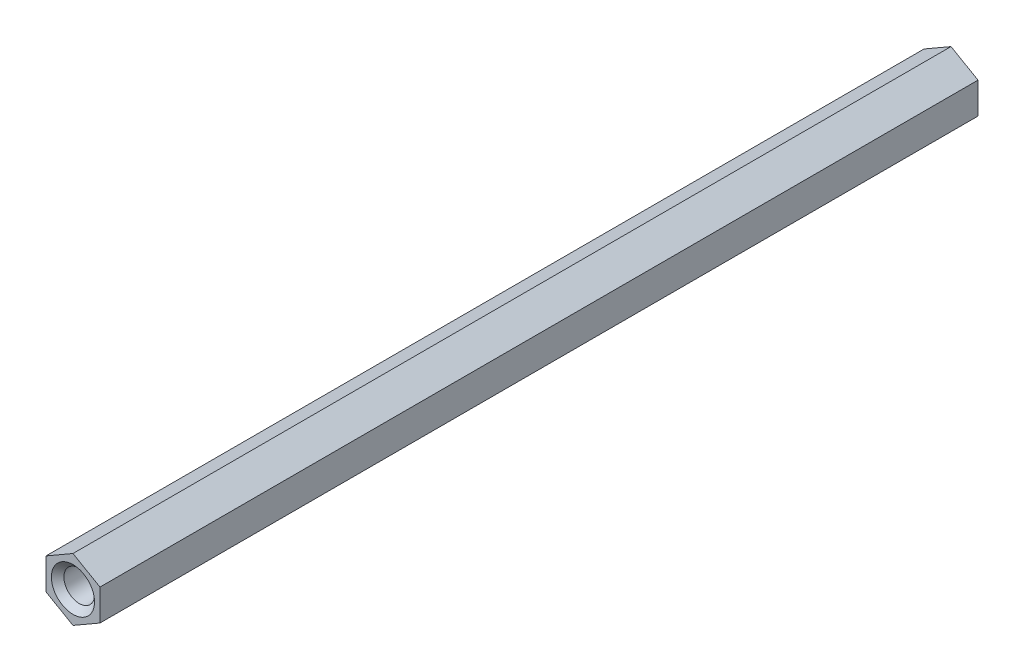
ISO-10303-21;
HEADER;
FILE_DESCRIPTION(('STEP AP214'),'2;1');
FILE_NAME('part.step','',(''),(''),'','','');
FILE_SCHEMA(('AUTOMOTIVE_DESIGN { 1 0 10303 214 1 1 1 1 }'));
ENDSEC;
DATA;
#1=APPLICATION_CONTEXT('core data for automotive mechanical design processes');
#2=APPLICATION_PROTOCOL_DEFINITION('international standard','automotive_design',2000,#1);
#3=PRODUCT_CONTEXT('',#1,'mechanical');
#4=PRODUCT('Part','Part','',(#3));
#5=PRODUCT_RELATED_PRODUCT_CATEGORY('part','',(#4));
#6=PRODUCT_DEFINITION_FORMATION('','',#4);
#7=PRODUCT_DEFINITION_CONTEXT('part definition',#1,'design');
#8=PRODUCT_DEFINITION('design','',#6,#7);
#9=PRODUCT_DEFINITION_SHAPE('','',#8);
#10=(LENGTH_UNIT() NAMED_UNIT(*) SI_UNIT(.MILLI.,.METRE.));
#11=(NAMED_UNIT(*) PLANE_ANGLE_UNIT() SI_UNIT($,.RADIAN.));
#12=(NAMED_UNIT(*) SI_UNIT($,.STERADIAN.) SOLID_ANGLE_UNIT());
#13=UNCERTAINTY_MEASURE_WITH_UNIT(LENGTH_MEASURE(1.E-05),#10,'distance_accuracy_value','');
#14=(GEOMETRIC_REPRESENTATION_CONTEXT(3) GLOBAL_UNCERTAINTY_ASSIGNED_CONTEXT((#13)) GLOBAL_UNIT_ASSIGNED_CONTEXT((#10,
#11,#12)) REPRESENTATION_CONTEXT('',''));
#15=CARTESIAN_POINT('',(0.,0.,0.));
#16=DIRECTION('',(0.,0.,1.));
#17=DIRECTION('',(1.,0.,0.));
#18=AXIS2_PLACEMENT_3D('',#15,#16,#17);
#19=CARTESIAN_POINT('',(-4.7625,2.74963065701559,77.4999999999948));
#20=DIRECTION('',(0.5,-0.866025403784439,0.));
#21=DIRECTION('',(0.866025403784439,0.5,0.));
#22=AXIS2_PLACEMENT_3D('',#19,#20,#21);
#23=PLANE('',#22);
#24=DIRECTION('',(-0.866025403784439,-0.5,0.));
#25=VECTOR('',#24,1.);
#26=CARTESIAN_POINT('',(-4.7625,2.74963065701559,-77.4999999999948));
#27=LINE('',#26,#25);
#28=CARTESIAN_POINT('',(0.,5.49926131403118,-77.4999999999948));
#29=VERTEX_POINT('',#28);
#30=CARTESIAN_POINT('',(-4.7625,2.74963065701559,-77.4999999999948));
#31=VERTEX_POINT('',#30);
#32=EDGE_CURVE('E145',#29,#31,#27,.T.);
#33=ORIENTED_EDGE('',*,*,#32,.T.);
#34=DIRECTION('',(0.,0.,-1.));
#35=VECTOR('',#34,1.);
#36=CARTESIAN_POINT('',(-4.7625,2.74963065701559,77.4999999999948));
#37=LINE('',#36,#35);
#38=CARTESIAN_POINT('',(-4.7625,2.74963065701559,77.4999999999948));
#39=VERTEX_POINT('',#38);
#40=EDGE_CURVE('E11',#39,#31,#37,.T.);
#41=ORIENTED_EDGE('',*,*,#40,.F.);
#42=DIRECTION('',(-0.866025403784439,-0.5,0.));
#43=VECTOR('',#42,1.);
#44=CARTESIAN_POINT('',(-4.7625,2.74963065701559,77.4999999999948));
#45=LINE('',#44,#43);
#46=CARTESIAN_POINT('',(0.,5.49926131403118,77.4999999999948));
#47=VERTEX_POINT('',#46);
#48=EDGE_CURVE('E162',#47,#39,#45,.T.);
#49=ORIENTED_EDGE('',*,*,#48,.F.);
#50=DIRECTION('',(0.,0.,-1.));
#51=VECTOR('',#50,1.);
#52=CARTESIAN_POINT('',(0.,5.49926131403118,77.4999999999948));
#53=LINE('',#52,#51);
#54=EDGE_CURVE('E141',#47,#29,#53,.T.);
#55=ORIENTED_EDGE('',*,*,#54,.T.);
#56=EDGE_LOOP('',(#33,#41,#49,#55));
#57=FACE_BOUND('',#56,.T.);
#58=ADVANCED_FACE('F53',(#57),#23,.F.);
#59=CARTESIAN_POINT('',(-4.7625,-2.74963065701559,77.4999999999948));
#60=DIRECTION('',(1.,0.,0.));
#61=DIRECTION('',(0.,1.,0.));
#62=AXIS2_PLACEMENT_3D('',#59,#60,#61);
#63=PLANE('',#62);
#64=DIRECTION('',(0.,-1.,0.));
#65=VECTOR('',#64,1.);
#66=CARTESIAN_POINT('',(-4.7625,-2.74963065701559,-77.4999999999948));
#67=LINE('',#66,#65);
#68=CARTESIAN_POINT('',(-4.7625,-2.74963065701559,-77.4999999999948));
#69=VERTEX_POINT('',#68);
#70=EDGE_CURVE('E149',#31,#69,#67,.T.);
#71=ORIENTED_EDGE('',*,*,#70,.T.);
#72=DIRECTION('',(0.,0.,-1.));
#73=VECTOR('',#72,1.);
#74=CARTESIAN_POINT('',(-4.7625,-2.74963065701559,77.4999999999948));
#75=LINE('',#74,#73);
#76=CARTESIAN_POINT('',(-4.7625,-2.74963065701559,77.4999999999948));
#77=VERTEX_POINT('',#76);
#78=EDGE_CURVE('E62',#77,#69,#75,.T.);
#79=ORIENTED_EDGE('',*,*,#78,.F.);
#80=DIRECTION('',(0.,-1.,0.));
#81=VECTOR('',#80,1.);
#82=CARTESIAN_POINT('',(-4.7625,-2.74963065701559,77.4999999999948));
#83=LINE('',#82,#81);
#84=EDGE_CURVE('E108',#39,#77,#83,.T.);
#85=ORIENTED_EDGE('',*,*,#84,.F.);
#86=ORIENTED_EDGE('',*,*,#40,.T.);
#87=EDGE_LOOP('',(#71,#79,#85,#86));
#88=FACE_BOUND('',#87,.T.);
#89=ADVANCED_FACE('F191',(#88),#63,.F.);
#90=CARTESIAN_POINT('',(0.,-5.49926131403118,77.4999999999948));
#91=DIRECTION('',(0.5,0.866025403784439,0.));
#92=DIRECTION('',(-0.866025403784439,0.5,0.));
#93=AXIS2_PLACEMENT_3D('',#90,#91,#92);
#94=PLANE('',#93);
#95=DIRECTION('',(0.866025403784439,-0.5,0.));
#96=VECTOR('',#95,1.);
#97=CARTESIAN_POINT('',(0.,-5.49926131403118,-77.4999999999948));
#98=LINE('',#97,#96);
#99=CARTESIAN_POINT('',(0.,-5.49926131403118,-77.4999999999948));
#100=VERTEX_POINT('',#99);
#101=EDGE_CURVE('E153',#69,#100,#98,.T.);
#102=ORIENTED_EDGE('',*,*,#101,.T.);
#103=DIRECTION('',(0.,0.,-1.));
#104=VECTOR('',#103,1.);
#105=CARTESIAN_POINT('',(0.,-5.49926131403118,77.4999999999948));
#106=LINE('',#105,#104);
#107=CARTESIAN_POINT('',(0.,-5.49926131403118,77.4999999999948));
#108=VERTEX_POINT('',#107);
#109=EDGE_CURVE('E134',#108,#100,#106,.T.);
#110=ORIENTED_EDGE('',*,*,#109,.F.);
#111=DIRECTION('',(0.866025403784439,-0.5,0.));
#112=VECTOR('',#111,1.);
#113=CARTESIAN_POINT('',(0.,-5.49926131403118,77.4999999999948));
#114=LINE('',#113,#112);
#115=EDGE_CURVE('E123',#77,#108,#114,.T.);
#116=ORIENTED_EDGE('',*,*,#115,.F.);
#117=ORIENTED_EDGE('',*,*,#78,.T.);
#118=EDGE_LOOP('',(#102,#110,#116,#117));
#119=FACE_BOUND('',#118,.T.);
#120=ADVANCED_FACE('F172',(#119),#94,.F.);
#121=CARTESIAN_POINT('',(4.7625,-2.7496306570156,77.4999999999948));
#122=DIRECTION('',(-0.5,0.866025403784439,0.));
#123=DIRECTION('',(-0.866025403784439,-0.5,0.));
#124=AXIS2_PLACEMENT_3D('',#121,#122,#123);
#125=PLANE('',#124);
#126=DIRECTION('',(0.866025403784439,0.5,0.));
#127=VECTOR('',#126,1.);
#128=CARTESIAN_POINT('',(4.7625,-2.7496306570156,-77.4999999999948));
#129=LINE('',#128,#127);
#130=CARTESIAN_POINT('',(4.7625,-2.7496306570156,-77.4999999999948));
#131=VERTEX_POINT('',#130);
#132=EDGE_CURVE('E132',#100,#131,#129,.T.);
#133=ORIENTED_EDGE('',*,*,#132,.T.);
#134=DIRECTION('',(0.,0.,-1.));
#135=VECTOR('',#134,1.);
#136=CARTESIAN_POINT('',(4.7625,-2.7496306570156,77.4999999999948));
#137=LINE('',#136,#135);
#138=CARTESIAN_POINT('',(4.7625,-2.7496306570156,77.4999999999948));
#139=VERTEX_POINT('',#138);
#140=EDGE_CURVE('E129',#139,#131,#137,.T.);
#141=ORIENTED_EDGE('',*,*,#140,.F.);
#142=DIRECTION('',(0.866025403784439,0.5,0.));
#143=VECTOR('',#142,1.);
#144=CARTESIAN_POINT('',(4.7625,-2.7496306570156,77.4999999999948));
#145=LINE('',#144,#143);
#146=EDGE_CURVE('E117',#108,#139,#145,.T.);
#147=ORIENTED_EDGE('',*,*,#146,.F.);
#148=ORIENTED_EDGE('',*,*,#109,.T.);
#149=EDGE_LOOP('',(#133,#141,#147,#148));
#150=FACE_BOUND('',#149,.T.);
#151=ADVANCED_FACE('F130',(#150),#125,.F.);
#152=CARTESIAN_POINT('',(4.7625,2.74963065701559,77.4999999999948));
#153=DIRECTION('',(-1.,0.,0.));
#154=DIRECTION('',(0.,0.,1.));
#155=AXIS2_PLACEMENT_3D('',#152,#153,#154);
#156=PLANE('',#155);
#157=DIRECTION('',(0.,1.,0.));
#158=VECTOR('',#157,1.);
#159=CARTESIAN_POINT('',(4.7625,2.74963065701559,-77.4999999999948));
#160=LINE('',#159,#158);
#161=CARTESIAN_POINT('',(4.7625,2.74963065701559,-77.4999999999948));
#162=VERTEX_POINT('',#161);
#163=EDGE_CURVE('E94',#131,#162,#160,.T.);
#164=ORIENTED_EDGE('',*,*,#163,.T.);
#165=DIRECTION('',(0.,0.,-1.));
#166=VECTOR('',#165,1.);
#167=CARTESIAN_POINT('',(4.7625,2.74963065701559,77.4999999999948));
#168=LINE('',#167,#166);
#169=CARTESIAN_POINT('',(4.7625,2.74963065701559,77.4999999999948));
#170=VERTEX_POINT('',#169);
#171=EDGE_CURVE('E135',#170,#162,#168,.T.);
#172=ORIENTED_EDGE('',*,*,#171,.F.);
#173=DIRECTION('',(0.,1.,0.));
#174=VECTOR('',#173,1.);
#175=CARTESIAN_POINT('',(4.7625,2.74963065701559,77.4999999999948));
#176=LINE('',#175,#174);
#177=EDGE_CURVE('E121',#139,#170,#176,.T.);
#178=ORIENTED_EDGE('',*,*,#177,.F.);
#179=ORIENTED_EDGE('',*,*,#140,.T.);
#180=EDGE_LOOP('',(#164,#172,#178,#179));
#181=FACE_BOUND('',#180,.T.);
#182=ADVANCED_FACE('F137',(#181),#156,.F.);
#183=CARTESIAN_POINT('',(0.,5.49926131403118,77.4999999999948));
#184=DIRECTION('',(-0.5,-0.866025403784439,0.));
#185=DIRECTION('',(0.866025403784439,-0.5,0.));
#186=AXIS2_PLACEMENT_3D('',#183,#184,#185);
#187=PLANE('',#186);
#188=DIRECTION('',(-0.866025403784439,0.5,0.));
#189=VECTOR('',#188,1.);
#190=CARTESIAN_POINT('',(0.,5.49926131403118,-77.4999999999948));
#191=LINE('',#190,#189);
#192=EDGE_CURVE('E100',#162,#29,#191,.T.);
#193=ORIENTED_EDGE('',*,*,#192,.T.);
#194=ORIENTED_EDGE('',*,*,#54,.F.);
#195=DIRECTION('',(-0.866025403784439,0.5,0.));
#196=VECTOR('',#195,1.);
#197=CARTESIAN_POINT('',(0.,5.49926131403118,77.4999999999948));
#198=LINE('',#197,#196);
#199=EDGE_CURVE('E70',#170,#47,#198,.T.);
#200=ORIENTED_EDGE('',*,*,#199,.F.);
#201=ORIENTED_EDGE('',*,*,#171,.T.);
#202=EDGE_LOOP('',(#193,#194,#200,#201));
#203=FACE_BOUND('',#202,.T.);
#204=ADVANCED_FACE('F179',(#203),#187,.F.);
#205=CARTESIAN_POINT('',(0.,0.,77.4999999999948));
#206=DIRECTION('',(0.,0.,-1.));
#207=DIRECTION('',(-1.,0.,0.));
#208=AXIS2_PLACEMENT_3D('',#205,#206,#207);
#209=PLANE('',#208);
#210=CARTESIAN_POINT('',(0.,0.,77.4999999999948));
#211=DIRECTION('',(0.,0.,1.));
#212=DIRECTION('',(1.,0.,0.));
#213=AXIS2_PLACEMENT_3D('',#210,#211,#212);
#214=CIRCLE('',#213,3.81);
#215=CARTESIAN_POINT('',(3.81,0.,77.4999999999948));
#216=VERTEX_POINT('',#215);
#217=EDGE_CURVE('E312',#216,#216,#214,.T.);
#218=ORIENTED_EDGE('',*,*,#217,.F.);
#219=EDGE_LOOP('',(#218));
#220=FACE_BOUND('',#219,.T.);
#221=ORIENTED_EDGE('',*,*,#48,.T.);
#222=ORIENTED_EDGE('',*,*,#84,.T.);
#223=ORIENTED_EDGE('',*,*,#115,.T.);
#224=ORIENTED_EDGE('',*,*,#146,.T.);
#225=ORIENTED_EDGE('',*,*,#177,.T.);
#226=ORIENTED_EDGE('',*,*,#199,.T.);
#227=EDGE_LOOP('',(#221,#222,#223,#224,#225,#226));
#228=FACE_BOUND('',#227,.T.);
#229=ADVANCED_FACE('F119',(#220,#228),#209,.F.);
#230=CARTESIAN_POINT('',(0.,0.,-77.4999999999948));
#231=DIRECTION('',(0.,0.,-1.));
#232=DIRECTION('',(-1.,0.,0.));
#233=AXIS2_PLACEMENT_3D('',#230,#231,#232);
#234=PLANE('',#233);
#235=CARTESIAN_POINT('',(0.,0.,-77.4999999999948));
#236=DIRECTION('',(0.,0.,-1.));
#237=DIRECTION('',(-1.,0.,0.));
#238=AXIS2_PLACEMENT_3D('',#235,#236,#237);
#239=CIRCLE('',#238,3.81);
#240=CARTESIAN_POINT('',(-3.81,0.,-77.4999999999948));
#241=VERTEX_POINT('',#240);
#242=EDGE_CURVE('E302',#241,#241,#239,.T.);
#243=ORIENTED_EDGE('',*,*,#242,.F.);
#244=EDGE_LOOP('',(#243));
#245=FACE_BOUND('',#244,.T.);
#246=ORIENTED_EDGE('',*,*,#32,.F.);
#247=ORIENTED_EDGE('',*,*,#192,.F.);
#248=ORIENTED_EDGE('',*,*,#163,.F.);
#249=ORIENTED_EDGE('',*,*,#132,.F.);
#250=ORIENTED_EDGE('',*,*,#101,.F.);
#251=ORIENTED_EDGE('',*,*,#70,.F.);
#252=EDGE_LOOP('',(#246,#247,#248,#249,#250,#251));
#253=FACE_BOUND('',#252,.T.);
#254=ADVANCED_FACE('F175',(#245,#253),#234,.T.);
#255=CARTESIAN_POINT('',(0.,0.,62.2599999999948));
#256=DIRECTION('',(0.,0.,1.));
#257=DIRECTION('',(1.,0.,0.));
#258=AXIS2_PLACEMENT_3D('',#255,#256,#257);
#259=CONICAL_SURFACE('',#258,2.7051,1.02974425867665);
#260=CARTESIAN_POINT('',(0.,0.,60.6346119394633));
#261=VERTEX_POINT('',#260);
#262=VERTEX_LOOP('',#261);
#263=FACE_BOUND('',#262,.T.);
#264=CARTESIAN_POINT('',(0.,0.,62.2599999999948));
#265=DIRECTION('',(0.,0.,1.));
#266=DIRECTION('',(1.,0.,0.));
#267=AXIS2_PLACEMENT_3D('',#264,#265,#266);
#268=CIRCLE('',#267,2.7051);
#269=CARTESIAN_POINT('',(2.7051,0.,62.2599999999948));
#270=VERTEX_POINT('',#269);
#271=EDGE_CURVE('E150',#270,#270,#268,.T.);
#272=ORIENTED_EDGE('',*,*,#271,.T.);
#273=EDGE_LOOP('',(#272));
#274=FACE_BOUND('',#273,.T.);
#275=ADVANCED_FACE('F231',(#263,#274),#259,.F.);
#276=CARTESIAN_POINT('',(0.,0.,77.4999999999948));
#277=DIRECTION('',(0.,0.,1.));
#278=DIRECTION('',(1.,0.,0.));
#279=AXIS2_PLACEMENT_3D('',#276,#277,#278);
#280=CYLINDRICAL_SURFACE('',#279,2.7051);
#281=ORIENTED_EDGE('',*,*,#271,.F.);
#282=EDGE_LOOP('',(#281));
#283=FACE_BOUND('',#282,.T.);
#284=CARTESIAN_POINT('',(0.,0.,76.3950999999948));
#285=DIRECTION('',(0.,0.,1.));
#286=DIRECTION('',(1.,0.,0.));
#287=AXIS2_PLACEMENT_3D('',#284,#285,#286);
#288=CIRCLE('',#287,2.7051);
#289=CARTESIAN_POINT('',(2.7051,0.,76.3950999999948));
#290=VERTEX_POINT('',#289);
#291=EDGE_CURVE('E316',#290,#290,#288,.T.);
#292=ORIENTED_EDGE('',*,*,#291,.T.);
#293=EDGE_LOOP('',(#292));
#294=FACE_BOUND('',#293,.T.);
#295=ADVANCED_FACE('F241',(#283,#294),#280,.F.);
#296=CARTESIAN_POINT('',(0.,0.,77.4999999999948));
#297=DIRECTION('',(0.,0.,1.));
#298=DIRECTION('',(1.,0.,0.));
#299=AXIS2_PLACEMENT_3D('',#296,#297,#298);
#300=CONICAL_SURFACE('',#299,3.81,0.785398163397453);
#301=ORIENTED_EDGE('',*,*,#291,.F.);
#302=EDGE_LOOP('',(#301));
#303=FACE_BOUND('',#302,.T.);
#304=ORIENTED_EDGE('',*,*,#217,.T.);
#305=EDGE_LOOP('',(#304));
#306=FACE_BOUND('',#305,.T.);
#307=ADVANCED_FACE('F252',(#303,#306),#300,.F.);
#308=CARTESIAN_POINT('',(0.,0.,-60.2660999999948));
#309=DIRECTION('',(0.,0.,-1.));
#310=DIRECTION('',(-1.,0.,0.));
#311=AXIS2_PLACEMENT_3D('',#308,#309,#310);
#312=CONICAL_SURFACE('',#311,2.7051,1.02974425867665);
#313=CARTESIAN_POINT('',(0.,0.,-58.6407119394633));
#314=VERTEX_POINT('',#313);
#315=VERTEX_LOOP('',#314);
#316=FACE_BOUND('',#315,.T.);
#317=CARTESIAN_POINT('',(0.,0.,-60.2660999999948));
#318=DIRECTION('',(0.,0.,-1.));
#319=DIRECTION('',(-1.,0.,0.));
#320=AXIS2_PLACEMENT_3D('',#317,#318,#319);
#321=CIRCLE('',#320,2.7051);
#322=CARTESIAN_POINT('',(-2.7051,0.,-60.2660999999948));
#323=VERTEX_POINT('',#322);
#324=EDGE_CURVE('E306',#323,#323,#321,.T.);
#325=ORIENTED_EDGE('',*,*,#324,.T.);
#326=EDGE_LOOP('',(#325));
#327=FACE_BOUND('',#326,.T.);
#328=ADVANCED_FACE('F262',(#316,#327),#312,.F.);
#329=CARTESIAN_POINT('',(0.,0.,-77.4999999999948));
#330=DIRECTION('',(0.,0.,-1.));
#331=DIRECTION('',(-1.,0.,0.));
#332=AXIS2_PLACEMENT_3D('',#329,#330,#331);
#333=CYLINDRICAL_SURFACE('',#332,2.7051);
#334=ORIENTED_EDGE('',*,*,#324,.F.);
#335=EDGE_LOOP('',(#334));
#336=FACE_BOUND('',#335,.T.);
#337=CARTESIAN_POINT('',(0.,0.,-76.3950999999948));
#338=DIRECTION('',(0.,0.,-1.));
#339=DIRECTION('',(-1.,0.,0.));
#340=AXIS2_PLACEMENT_3D('',#337,#338,#339);
#341=CIRCLE('',#340,2.7051);
#342=CARTESIAN_POINT('',(-2.7051,0.,-76.3950999999948));
#343=VERTEX_POINT('',#342);
#344=EDGE_CURVE('E299',#343,#343,#341,.T.);
#345=ORIENTED_EDGE('',*,*,#344,.T.);
#346=EDGE_LOOP('',(#345));
#347=FACE_BOUND('',#346,.T.);
#348=ADVANCED_FACE('F271',(#336,#347),#333,.F.);
#349=CARTESIAN_POINT('',(0.,0.,-77.4999999999948));
#350=DIRECTION('',(0.,0.,-1.));
#351=DIRECTION('',(-1.,0.,0.));
#352=AXIS2_PLACEMENT_3D('',#349,#350,#351);
#353=CONICAL_SURFACE('',#352,3.81,0.785398163397452);
#354=ORIENTED_EDGE('',*,*,#344,.F.);
#355=EDGE_LOOP('',(#354));
#356=FACE_BOUND('',#355,.T.);
#357=ORIENTED_EDGE('',*,*,#242,.T.);
#358=EDGE_LOOP('',(#357));
#359=FACE_BOUND('',#358,.T.);
#360=ADVANCED_FACE('F282',(#356,#359),#353,.F.);
#361=CLOSED_SHELL('',(#58,#89,#120,#151,#182,#204,#229,#254,#275,#295,#307,#328,#348,#360));
#362=MANIFOLD_SOLID_BREP('B2',#361);
#363=ADVANCED_BREP_SHAPE_REPRESENTATION('',(#18,#362),#14);
#364=SHAPE_DEFINITION_REPRESENTATION(#9,#363);
ENDSEC;
END-ISO-10303-21;
